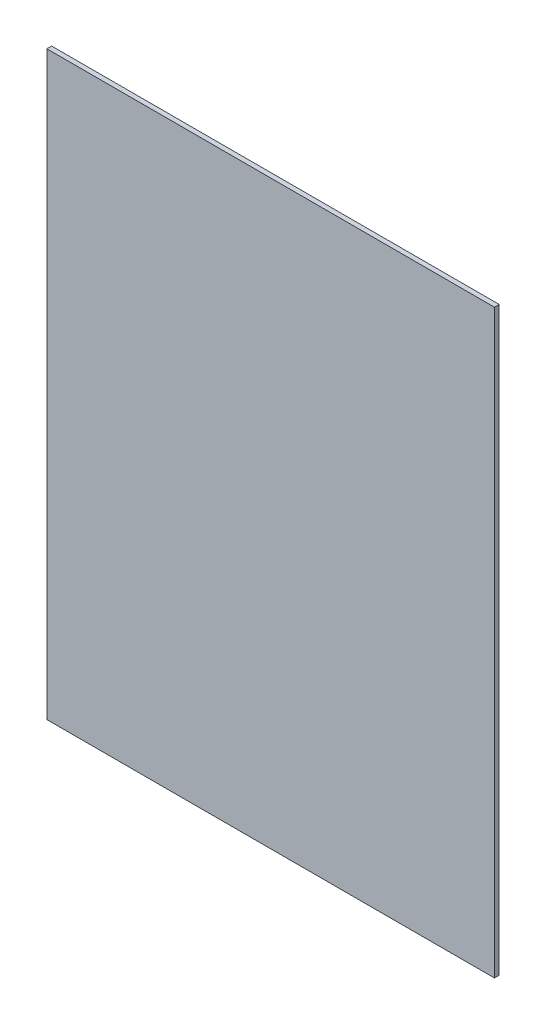
ISO-10303-21;
HEADER;
FILE_DESCRIPTION(('STEP AP214'),'2;1');
FILE_NAME('part.step','',(''),(''),'','','');
FILE_SCHEMA(('AUTOMOTIVE_DESIGN { 1 0 10303 214 1 1 1 1 }'));
ENDSEC;
DATA;
#1=APPLICATION_CONTEXT('core data for automotive mechanical design processes');
#2=APPLICATION_PROTOCOL_DEFINITION('international standard','automotive_design',2000,#1);
#3=PRODUCT_CONTEXT('',#1,'mechanical');
#4=PRODUCT('Part','Part','',(#3));
#5=PRODUCT_RELATED_PRODUCT_CATEGORY('part','',(#4));
#6=PRODUCT_DEFINITION_FORMATION('','',#4);
#7=PRODUCT_DEFINITION_CONTEXT('part definition',#1,'design');
#8=PRODUCT_DEFINITION('design','',#6,#7);
#9=PRODUCT_DEFINITION_SHAPE('','',#8);
#10=(LENGTH_UNIT() NAMED_UNIT(*) SI_UNIT(.MILLI.,.METRE.));
#11=(NAMED_UNIT(*) PLANE_ANGLE_UNIT() SI_UNIT($,.RADIAN.));
#12=(NAMED_UNIT(*) SI_UNIT($,.STERADIAN.) SOLID_ANGLE_UNIT());
#13=UNCERTAINTY_MEASURE_WITH_UNIT(LENGTH_MEASURE(1.E-05),#10,'distance_accuracy_value','');
#14=(GEOMETRIC_REPRESENTATION_CONTEXT(3) GLOBAL_UNCERTAINTY_ASSIGNED_CONTEXT((#13)) GLOBAL_UNIT_ASSIGNED_CONTEXT((#10,
#11,#12)) REPRESENTATION_CONTEXT('',''));
#15=CARTESIAN_POINT('',(0.,0.,0.));
#16=DIRECTION('',(0.,0.,1.));
#17=DIRECTION('',(1.,0.,0.));
#18=AXIS2_PLACEMENT_3D('',#15,#16,#17);
#19=CARTESIAN_POINT('',(-298.45,0.,6.35));
#20=DIRECTION('',(1.,0.,0.));
#21=DIRECTION('',(0.,0.,-1.));
#22=AXIS2_PLACEMENT_3D('',#19,#20,#21);
#23=PLANE('',#22);
#24=DIRECTION('',(0.,-1.,0.));
#25=VECTOR('',#24,1.);
#26=CARTESIAN_POINT('',(-298.45,0.,0.));
#27=LINE('',#26,#25);
#28=CARTESIAN_POINT('',(-298.45,774.7,0.));
#29=VERTEX_POINT('',#28);
#30=CARTESIAN_POINT('',(-298.45,0.,0.));
#31=VERTEX_POINT('',#30);
#32=EDGE_CURVE('E113',#29,#31,#27,.T.);
#33=ORIENTED_EDGE('',*,*,#32,.T.);
#34=DIRECTION('',(0.,0.,-1.));
#35=VECTOR('',#34,1.);
#36=CARTESIAN_POINT('',(-298.45,0.,6.35));
#37=LINE('',#36,#35);
#38=CARTESIAN_POINT('',(-298.45,0.,6.35));
#39=VERTEX_POINT('',#38);
#40=EDGE_CURVE('E11',#39,#31,#37,.T.);
#41=ORIENTED_EDGE('',*,*,#40,.F.);
#42=DIRECTION('',(0.,-1.,0.));
#43=VECTOR('',#42,1.);
#44=CARTESIAN_POINT('',(-298.45,0.,6.35));
#45=LINE('',#44,#43);
#46=CARTESIAN_POINT('',(-298.45,774.7,6.35));
#47=VERTEX_POINT('',#46);
#48=EDGE_CURVE('E97',#47,#39,#45,.T.);
#49=ORIENTED_EDGE('',*,*,#48,.F.);
#50=DIRECTION('',(0.,0.,-1.));
#51=VECTOR('',#50,1.);
#52=CARTESIAN_POINT('',(-298.45,774.7,6.35));
#53=LINE('',#52,#51);
#54=EDGE_CURVE('E109',#47,#29,#53,.T.);
#55=ORIENTED_EDGE('',*,*,#54,.T.);
#56=EDGE_LOOP('',(#33,#41,#49,#55));
#57=FACE_BOUND('',#56,.T.);
#58=ADVANCED_FACE('F45',(#57),#23,.F.);
#59=CARTESIAN_POINT('',(-298.45,0.,6.35));
#60=DIRECTION('',(0.,1.,0.));
#61=DIRECTION('',(0.,0.,1.));
#62=AXIS2_PLACEMENT_3D('',#59,#60,#61);
#63=PLANE('',#62);
#64=DIRECTION('',(1.,0.,0.));
#65=VECTOR('',#64,1.);
#66=CARTESIAN_POINT('',(-298.45,0.,0.));
#67=LINE('',#66,#65);
#68=CARTESIAN_POINT('',(298.45,0.,0.));
#69=VERTEX_POINT('',#68);
#70=EDGE_CURVE('E102',#31,#69,#67,.T.);
#71=ORIENTED_EDGE('',*,*,#70,.T.);
#72=DIRECTION('',(0.,0.,-1.));
#73=VECTOR('',#72,1.);
#74=CARTESIAN_POINT('',(298.45,0.,6.35));
#75=LINE('',#74,#73);
#76=CARTESIAN_POINT('',(298.45,0.,6.35));
#77=VERTEX_POINT('',#76);
#78=EDGE_CURVE('E54',#77,#69,#75,.T.);
#79=ORIENTED_EDGE('',*,*,#78,.F.);
#80=DIRECTION('',(1.,0.,0.));
#81=VECTOR('',#80,1.);
#82=CARTESIAN_POINT('',(-298.45,0.,6.35));
#83=LINE('',#82,#81);
#84=EDGE_CURVE('E92',#39,#77,#83,.T.);
#85=ORIENTED_EDGE('',*,*,#84,.F.);
#86=ORIENTED_EDGE('',*,*,#40,.T.);
#87=EDGE_LOOP('',(#71,#79,#85,#86));
#88=FACE_BOUND('',#87,.T.);
#89=ADVANCED_FACE('F101',(#88),#63,.F.);
#90=CARTESIAN_POINT('',(298.45,0.,6.35));
#91=DIRECTION('',(-1.,0.,0.));
#92=DIRECTION('',(0.,0.,1.));
#93=AXIS2_PLACEMENT_3D('',#90,#91,#92);
#94=PLANE('',#93);
#95=DIRECTION('',(0.,1.,0.));
#96=VECTOR('',#95,1.);
#97=CARTESIAN_POINT('',(298.45,0.,0.));
#98=LINE('',#97,#96);
#99=CARTESIAN_POINT('',(298.45,774.7,0.));
#100=VERTEX_POINT('',#99);
#101=EDGE_CURVE('E79',#69,#100,#98,.T.);
#102=ORIENTED_EDGE('',*,*,#101,.T.);
#103=DIRECTION('',(0.,0.,-1.));
#104=VECTOR('',#103,1.);
#105=CARTESIAN_POINT('',(298.45,774.7,6.35));
#106=LINE('',#105,#104);
#107=CARTESIAN_POINT('',(298.45,774.7,6.35));
#108=VERTEX_POINT('',#107);
#109=EDGE_CURVE('E104',#108,#100,#106,.T.);
#110=ORIENTED_EDGE('',*,*,#109,.F.);
#111=DIRECTION('',(0.,1.,0.));
#112=VECTOR('',#111,1.);
#113=CARTESIAN_POINT('',(298.45,0.,6.35));
#114=LINE('',#113,#112);
#115=EDGE_CURVE('E95',#77,#108,#114,.T.);
#116=ORIENTED_EDGE('',*,*,#115,.F.);
#117=ORIENTED_EDGE('',*,*,#78,.T.);
#118=EDGE_LOOP('',(#102,#110,#116,#117));
#119=FACE_BOUND('',#118,.T.);
#120=ADVANCED_FACE('F105',(#119),#94,.F.);
#121=CARTESIAN_POINT('',(-298.45,774.7,6.35));
#122=DIRECTION('',(0.,-1.,0.));
#123=DIRECTION('',(0.,0.,-1.));
#124=AXIS2_PLACEMENT_3D('',#121,#122,#123);
#125=PLANE('',#124);
#126=DIRECTION('',(-1.,0.,0.));
#127=VECTOR('',#126,1.);
#128=CARTESIAN_POINT('',(-298.45,774.7,0.));
#129=LINE('',#128,#127);
#130=EDGE_CURVE('E85',#100,#29,#129,.T.);
#131=ORIENTED_EDGE('',*,*,#130,.T.);
#132=ORIENTED_EDGE('',*,*,#54,.F.);
#133=DIRECTION('',(-1.,0.,0.));
#134=VECTOR('',#133,1.);
#135=CARTESIAN_POINT('',(-298.45,774.7,6.35));
#136=LINE('',#135,#134);
#137=EDGE_CURVE('E62',#108,#47,#136,.T.);
#138=ORIENTED_EDGE('',*,*,#137,.F.);
#139=ORIENTED_EDGE('',*,*,#109,.T.);
#140=EDGE_LOOP('',(#131,#132,#138,#139));
#141=FACE_BOUND('',#140,.T.);
#142=ADVANCED_FACE('F126',(#141),#125,.F.);
#143=CARTESIAN_POINT('',(0.,0.,6.35));
#144=DIRECTION('',(0.,0.,-1.));
#145=DIRECTION('',(-1.,0.,0.));
#146=AXIS2_PLACEMENT_3D('',#143,#144,#145);
#147=PLANE('',#146);
#148=ORIENTED_EDGE('',*,*,#48,.T.);
#149=ORIENTED_EDGE('',*,*,#84,.T.);
#150=ORIENTED_EDGE('',*,*,#115,.T.);
#151=ORIENTED_EDGE('',*,*,#137,.T.);
#152=EDGE_LOOP('',(#148,#149,#150,#151));
#153=FACE_BOUND('',#152,.T.);
#154=ADVANCED_FACE('F93',(#153),#147,.F.);
#155=CARTESIAN_POINT('',(0.,0.,0.));
#156=DIRECTION('',(0.,0.,-1.));
#157=DIRECTION('',(-1.,0.,0.));
#158=AXIS2_PLACEMENT_3D('',#155,#156,#157);
#159=PLANE('',#158);
#160=ORIENTED_EDGE('',*,*,#32,.F.);
#161=ORIENTED_EDGE('',*,*,#130,.F.);
#162=ORIENTED_EDGE('',*,*,#101,.F.);
#163=ORIENTED_EDGE('',*,*,#70,.F.);
#164=EDGE_LOOP('',(#160,#161,#162,#163));
#165=FACE_BOUND('',#164,.T.);
#166=ADVANCED_FACE('F129',(#165),#159,.T.);
#167=CLOSED_SHELL('',(#58,#89,#120,#142,#154,#166));
#168=MANIFOLD_SOLID_BREP('B2',#167);
#169=ADVANCED_BREP_SHAPE_REPRESENTATION('',(#18,#168),#14);
#170=SHAPE_DEFINITION_REPRESENTATION(#9,#169);
ENDSEC;
END-ISO-10303-21;
